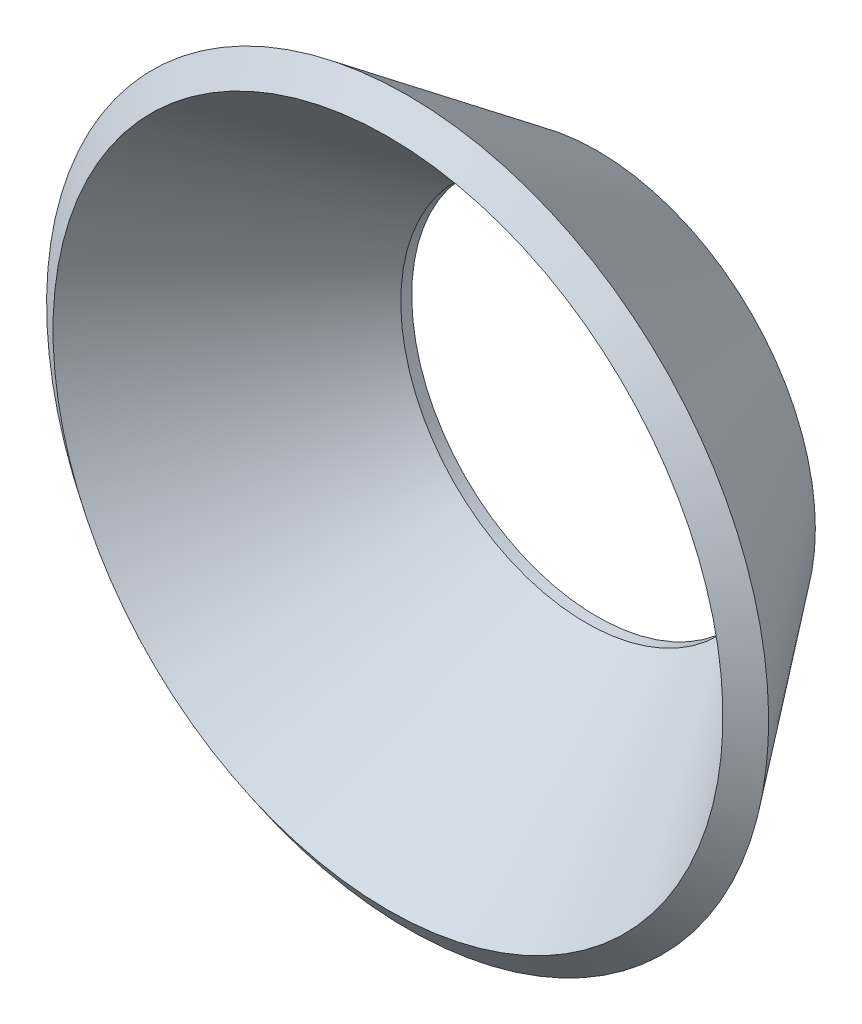
ISO-10303-21;
HEADER;
FILE_DESCRIPTION(('STEP AP214'),'2;1');
FILE_NAME('part.step','',(''),(''),'','','');
FILE_SCHEMA(('AUTOMOTIVE_DESIGN { 1 0 10303 214 1 1 1 1 }'));
ENDSEC;
DATA;
#1=APPLICATION_CONTEXT('core data for automotive mechanical design processes');
#2=APPLICATION_PROTOCOL_DEFINITION('international standard','automotive_design',2000,#1);
#3=PRODUCT_CONTEXT('',#1,'mechanical');
#4=PRODUCT('Part','Part','',(#3));
#5=PRODUCT_RELATED_PRODUCT_CATEGORY('part','',(#4));
#6=PRODUCT_DEFINITION_FORMATION('','',#4);
#7=PRODUCT_DEFINITION_CONTEXT('part definition',#1,'design');
#8=PRODUCT_DEFINITION('design','',#6,#7);
#9=PRODUCT_DEFINITION_SHAPE('','',#8);
#10=(LENGTH_UNIT() NAMED_UNIT(*) SI_UNIT(.MILLI.,.METRE.));
#11=(NAMED_UNIT(*) PLANE_ANGLE_UNIT() SI_UNIT($,.RADIAN.));
#12=(NAMED_UNIT(*) SI_UNIT($,.STERADIAN.) SOLID_ANGLE_UNIT());
#13=UNCERTAINTY_MEASURE_WITH_UNIT(LENGTH_MEASURE(1.E-05),#10,'distance_accuracy_value','');
#14=(GEOMETRIC_REPRESENTATION_CONTEXT(3) GLOBAL_UNCERTAINTY_ASSIGNED_CONTEXT((#13)) GLOBAL_UNIT_ASSIGNED_CONTEXT((#10,
#11,#12)) REPRESENTATION_CONTEXT('',''));
#15=CARTESIAN_POINT('',(0.,0.,0.));
#16=DIRECTION('',(0.,0.,1.));
#17=DIRECTION('',(1.,0.,0.));
#18=AXIS2_PLACEMENT_3D('',#15,#16,#17);
#19=CARTESIAN_POINT('',(0.,3.175,0.));
#20=DIRECTION('',(0.,0.,-1.));
#21=DIRECTION('',(0.,1.,0.));
#22=AXIS2_PLACEMENT_3D('',#19,#20,#21);
#23=PLANE('',#22);
#24=CARTESIAN_POINT('',(0.,0.,0.));
#25=DIRECTION('',(0.,0.,-1.));
#26=DIRECTION('',(0.,1.,0.));
#27=AXIS2_PLACEMENT_3D('',#24,#25,#26);
#28=CIRCLE('',#27,3.7338);
#29=CARTESIAN_POINT('',(0.,3.7338,0.));
#30=VERTEX_POINT('',#29);
#31=EDGE_CURVE('E50',#30,#30,#28,.T.);
#32=ORIENTED_EDGE('',*,*,#31,.T.);
#33=EDGE_LOOP('',(#32));
#34=FACE_BOUND('',#33,.T.);
#35=CARTESIAN_POINT('',(0.,0.,0.));
#36=DIRECTION('',(0.,0.,-1.));
#37=DIRECTION('',(0.,1.,0.));
#38=AXIS2_PLACEMENT_3D('',#35,#36,#37);
#39=CIRCLE('',#38,3.175);
#40=CARTESIAN_POINT('',(0.,3.175,0.));
#41=VERTEX_POINT('',#40);
#42=EDGE_CURVE('E10',#41,#41,#39,.T.);
#43=ORIENTED_EDGE('',*,*,#42,.F.);
#44=EDGE_LOOP('',(#43));
#45=FACE_BOUND('',#44,.T.);
#46=ADVANCED_FACE('F31',(#34,#45),#23,.T.);
#47=CARTESIAN_POINT('',(0.,0.,0.));
#48=DIRECTION('',(0.,0.,-1.));
#49=DIRECTION('',(0.,1.,0.));
#50=AXIS2_PLACEMENT_3D('',#47,#48,#49);
#51=CYLINDRICAL_SURFACE('',#50,3.175);
#52=ORIENTED_EDGE('',*,*,#42,.T.);
#53=EDGE_LOOP('',(#52));
#54=FACE_BOUND('',#53,.T.);
#55=CARTESIAN_POINT('',(0.,0.,0.186971864537759));
#56=DIRECTION('',(0.,0.,-1.));
#57=DIRECTION('',(0.,1.,0.));
#58=AXIS2_PLACEMENT_3D('',#55,#56,#57);
#59=CIRCLE('',#58,3.175);
#60=CARTESIAN_POINT('',(0.,3.175,0.186971864537759));
#61=VERTEX_POINT('',#60);
#62=EDGE_CURVE('E37',#61,#61,#59,.T.);
#63=ORIENTED_EDGE('',*,*,#62,.F.);
#64=EDGE_LOOP('',(#63));
#65=FACE_BOUND('',#64,.T.);
#66=ADVANCED_FACE('F68',(#54,#65),#51,.F.);
#67=CARTESIAN_POINT('',(0.,0.,3.58194894776956));
#68=DIRECTION('',(0.,0.,1.));
#69=DIRECTION('',(0.,-1.,0.));
#70=AXIS2_PLACEMENT_3D('',#67,#68,#69);
#71=CONICAL_SURFACE('',#70,5.7332987310755,0.645771823237903);
#72=ORIENTED_EDGE('',*,*,#62,.T.);
#73=EDGE_LOOP('',(#72));
#74=FACE_BOUND('',#73,.T.);
#75=CARTESIAN_POINT('',(0.,0.,3.58194894776956));
#76=DIRECTION('',(0.,0.,-1.));
#77=DIRECTION('',(0.,1.,0.));
#78=AXIS2_PLACEMENT_3D('',#75,#76,#77);
#79=CIRCLE('',#78,5.7332987310755);
#80=CARTESIAN_POINT('',(0.,5.7332987310755,3.58194894776956));
#81=VERTEX_POINT('',#80);
#82=EDGE_CURVE('E41',#81,#81,#79,.T.);
#83=ORIENTED_EDGE('',*,*,#82,.F.);
#84=EDGE_LOOP('',(#83));
#85=FACE_BOUND('',#84,.T.);
#86=ADVANCED_FACE('F64',(#74,#85),#71,.F.);
#87=CARTESIAN_POINT('',(0.,0.,3.24565471283219));
#88=DIRECTION('',(0.,0.,-1.));
#89=DIRECTION('',(0.,1.,0.));
#90=AXIS2_PLACEMENT_3D('',#87,#88,#89);
#91=CONICAL_SURFACE('',#90,6.17957625408993,0.925024503556993);
#92=ORIENTED_EDGE('',*,*,#82,.T.);
#93=EDGE_LOOP('',(#92));
#94=FACE_BOUND('',#93,.T.);
#95=CARTESIAN_POINT('',(0.,0.,3.24565471283219));
#96=DIRECTION('',(0.,0.,-1.));
#97=DIRECTION('',(0.,1.,0.));
#98=AXIS2_PLACEMENT_3D('',#95,#96,#97);
#99=CIRCLE('',#98,6.17957625408993);
#100=CARTESIAN_POINT('',(0.,6.17957625408993,3.2456547128322));
#101=VERTEX_POINT('',#100);
#102=EDGE_CURVE('E45',#101,#101,#99,.T.);
#103=ORIENTED_EDGE('',*,*,#102,.F.);
#104=EDGE_LOOP('',(#103));
#105=FACE_BOUND('',#104,.T.);
#106=ADVANCED_FACE('F58',(#94,#105),#91,.T.);
#107=CARTESIAN_POINT('',(0.,0.,0.));
#108=DIRECTION('',(0.,0.,1.));
#109=DIRECTION('',(0.,-1.,0.));
#110=AXIS2_PLACEMENT_3D('',#107,#108,#109);
#111=CONICAL_SURFACE('',#110,3.7338,0.645771823237903);
#112=ORIENTED_EDGE('',*,*,#102,.T.);
#113=EDGE_LOOP('',(#112));
#114=FACE_BOUND('',#113,.T.);
#115=ORIENTED_EDGE('',*,*,#31,.F.);
#116=EDGE_LOOP('',(#115));
#117=FACE_BOUND('',#116,.T.);
#118=ADVANCED_FACE('F56',(#114,#117),#111,.T.);
#119=CLOSED_SHELL('',(#46,#66,#86,#106,#118));
#120=MANIFOLD_SOLID_BREP('B2',#119);
#121=ADVANCED_BREP_SHAPE_REPRESENTATION('',(#18,#120),#14);
#122=SHAPE_DEFINITION_REPRESENTATION(#9,#121);
ENDSEC;
END-ISO-10303-21;
